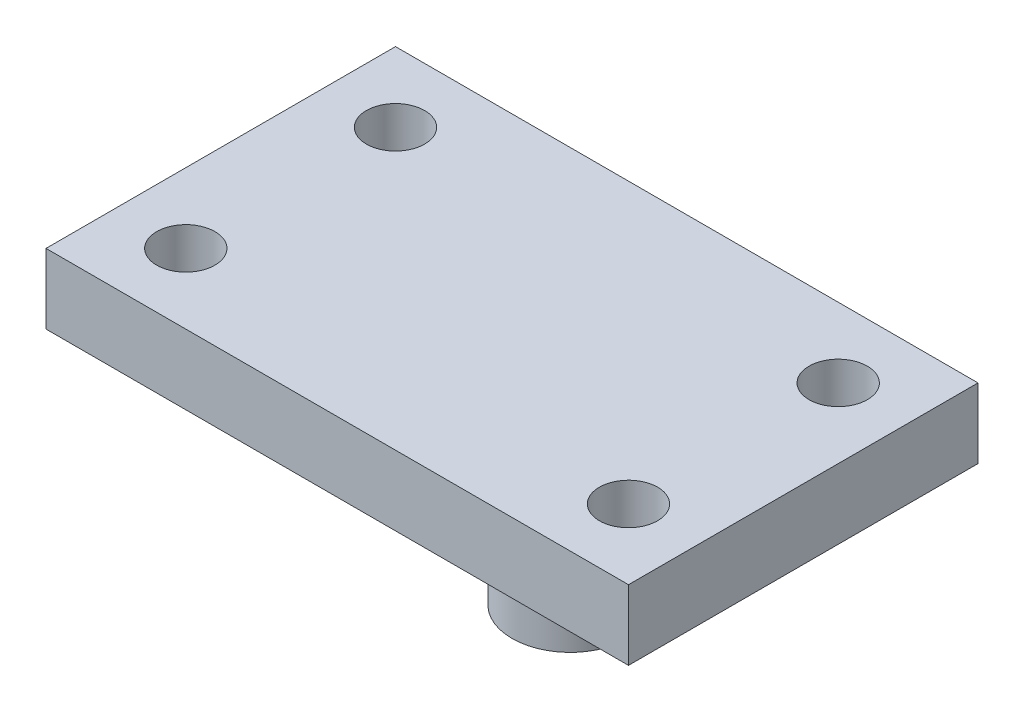
ISO-10303-21;
HEADER;
FILE_DESCRIPTION(('STEP AP214'),'2;1');
FILE_NAME('part.step','',(''),(''),'','','');
FILE_SCHEMA(('AUTOMOTIVE_DESIGN { 1 0 10303 214 1 1 1 1 }'));
ENDSEC;
DATA;
#1=APPLICATION_CONTEXT('core data for automotive mechanical design processes');
#2=APPLICATION_PROTOCOL_DEFINITION('international standard','automotive_design',2000,#1);
#3=PRODUCT_CONTEXT('',#1,'mechanical');
#4=PRODUCT('Part','Part','',(#3));
#5=PRODUCT_RELATED_PRODUCT_CATEGORY('part','',(#4));
#6=PRODUCT_DEFINITION_FORMATION('','',#4);
#7=PRODUCT_DEFINITION_CONTEXT('part definition',#1,'design');
#8=PRODUCT_DEFINITION('design','',#6,#7);
#9=PRODUCT_DEFINITION_SHAPE('','',#8);
#10=(LENGTH_UNIT() NAMED_UNIT(*) SI_UNIT(.MILLI.,.METRE.));
#11=(NAMED_UNIT(*) PLANE_ANGLE_UNIT() SI_UNIT($,.RADIAN.));
#12=(NAMED_UNIT(*) SI_UNIT($,.STERADIAN.) SOLID_ANGLE_UNIT());
#13=UNCERTAINTY_MEASURE_WITH_UNIT(LENGTH_MEASURE(1.E-05),#10,'distance_accuracy_value','');
#14=(GEOMETRIC_REPRESENTATION_CONTEXT(3) GLOBAL_UNCERTAINTY_ASSIGNED_CONTEXT((#13)) GLOBAL_UNIT_ASSIGNED_CONTEXT((#10,
#11,#12)) REPRESENTATION_CONTEXT('',''));
#15=CARTESIAN_POINT('',(0.,0.,0.));
#16=DIRECTION('',(0.,0.,1.));
#17=DIRECTION('',(1.,0.,0.));
#18=AXIS2_PLACEMENT_3D('',#15,#16,#17);
#19=CARTESIAN_POINT('',(125.,15.,-75.));
#20=DIRECTION('',(-1.,0.,0.));
#21=DIRECTION('',(0.,0.,1.));
#22=AXIS2_PLACEMENT_3D('',#19,#20,#21);
#23=PLANE('',#22);
#24=DIRECTION('',(0.,0.,-1.));
#25=VECTOR('',#24,1.);
#26=CARTESIAN_POINT('',(125.,-15.,-75.));
#27=LINE('',#26,#25);
#28=CARTESIAN_POINT('',(125.,-15.,75.));
#29=VERTEX_POINT('',#28);
#30=CARTESIAN_POINT('',(125.,-15.,-75.));
#31=VERTEX_POINT('',#30);
#32=EDGE_CURVE('E105',#29,#31,#27,.T.);
#33=ORIENTED_EDGE('',*,*,#32,.T.);
#34=DIRECTION('',(0.,-1.,0.));
#35=VECTOR('',#34,1.);
#36=CARTESIAN_POINT('',(125.,15.,-75.));
#37=LINE('',#36,#35);
#38=CARTESIAN_POINT('',(125.,15.,-75.));
#39=VERTEX_POINT('',#38);
#40=EDGE_CURVE('E47',#39,#31,#37,.T.);
#41=ORIENTED_EDGE('',*,*,#40,.F.);
#42=DIRECTION('',(0.,0.,-1.));
#43=VECTOR('',#42,1.);
#44=CARTESIAN_POINT('',(125.,15.,-75.));
#45=LINE('',#44,#43);
#46=CARTESIAN_POINT('',(125.,15.,75.));
#47=VERTEX_POINT('',#46);
#48=EDGE_CURVE('E91',#47,#39,#45,.T.);
#49=ORIENTED_EDGE('',*,*,#48,.F.);
#50=DIRECTION('',(0.,-1.,0.));
#51=VECTOR('',#50,1.);
#52=CARTESIAN_POINT('',(125.,15.,75.));
#53=LINE('',#52,#51);
#54=EDGE_CURVE('E101',#47,#29,#53,.T.);
#55=ORIENTED_EDGE('',*,*,#54,.T.);
#56=EDGE_LOOP('',(#33,#41,#49,#55));
#57=FACE_BOUND('',#56,.T.);
#58=ADVANCED_FACE('F39',(#57),#23,.F.);
#59=CARTESIAN_POINT('',(-125.,15.,-75.));
#60=DIRECTION('',(0.,0.,1.));
#61=DIRECTION('',(1.,0.,0.));
#62=AXIS2_PLACEMENT_3D('',#59,#60,#61);
#63=PLANE('',#62);
#64=DIRECTION('',(-1.,0.,0.));
#65=VECTOR('',#64,1.);
#66=CARTESIAN_POINT('',(-125.,-15.,-75.));
#67=LINE('',#66,#65);
#68=CARTESIAN_POINT('',(-125.,-15.,-75.));
#69=VERTEX_POINT('',#68);
#70=EDGE_CURVE('E96',#31,#69,#67,.T.);
#71=ORIENTED_EDGE('',*,*,#70,.T.);
#72=DIRECTION('',(0.,-1.,0.));
#73=VECTOR('',#72,1.);
#74=CARTESIAN_POINT('',(-125.,15.,-75.));
#75=LINE('',#74,#73);
#76=CARTESIAN_POINT('',(-125.,15.,-75.));
#77=VERTEX_POINT('',#76);
#78=EDGE_CURVE('E94',#77,#69,#75,.T.);
#79=ORIENTED_EDGE('',*,*,#78,.F.);
#80=DIRECTION('',(-1.,0.,0.));
#81=VECTOR('',#80,1.);
#82=CARTESIAN_POINT('',(-125.,15.,-75.));
#83=LINE('',#82,#81);
#84=EDGE_CURVE('E86',#39,#77,#83,.T.);
#85=ORIENTED_EDGE('',*,*,#84,.F.);
#86=ORIENTED_EDGE('',*,*,#40,.T.);
#87=EDGE_LOOP('',(#71,#79,#85,#86));
#88=FACE_BOUND('',#87,.T.);
#89=ADVANCED_FACE('F95',(#88),#63,.F.);
#90=CARTESIAN_POINT('',(-125.,15.,-75.));
#91=DIRECTION('',(1.,0.,0.));
#92=DIRECTION('',(0.,0.,-1.));
#93=AXIS2_PLACEMENT_3D('',#90,#91,#92);
#94=PLANE('',#93);
#95=DIRECTION('',(0.,0.,1.));
#96=VECTOR('',#95,1.);
#97=CARTESIAN_POINT('',(-125.,-15.,-75.));
#98=LINE('',#97,#96);
#99=CARTESIAN_POINT('',(-125.,-15.,75.));
#100=VERTEX_POINT('',#99);
#101=EDGE_CURVE('E72',#69,#100,#98,.T.);
#102=ORIENTED_EDGE('',*,*,#101,.T.);
#103=DIRECTION('',(0.,-1.,0.));
#104=VECTOR('',#103,1.);
#105=CARTESIAN_POINT('',(-125.,15.,75.));
#106=LINE('',#105,#104);
#107=CARTESIAN_POINT('',(-125.,15.,75.));
#108=VERTEX_POINT('',#107);
#109=EDGE_CURVE('E97',#108,#100,#106,.T.);
#110=ORIENTED_EDGE('',*,*,#109,.F.);
#111=DIRECTION('',(0.,0.,1.));
#112=VECTOR('',#111,1.);
#113=CARTESIAN_POINT('',(-125.,15.,-75.));
#114=LINE('',#113,#112);
#115=EDGE_CURVE('E89',#77,#108,#114,.T.);
#116=ORIENTED_EDGE('',*,*,#115,.F.);
#117=ORIENTED_EDGE('',*,*,#78,.T.);
#118=EDGE_LOOP('',(#102,#110,#116,#117));
#119=FACE_BOUND('',#118,.T.);
#120=ADVANCED_FACE('F99',(#119),#94,.F.);
#121=CARTESIAN_POINT('',(-125.,15.,75.));
#122=DIRECTION('',(0.,0.,-1.));
#123=DIRECTION('',(-1.,0.,0.));
#124=AXIS2_PLACEMENT_3D('',#121,#122,#123);
#125=PLANE('',#124);
#126=DIRECTION('',(1.,0.,0.));
#127=VECTOR('',#126,1.);
#128=CARTESIAN_POINT('',(-125.,-15.,75.));
#129=LINE('',#128,#127);
#130=EDGE_CURVE('E78',#100,#29,#129,.T.);
#131=ORIENTED_EDGE('',*,*,#130,.T.);
#132=ORIENTED_EDGE('',*,*,#54,.F.);
#133=DIRECTION('',(1.,0.,0.));
#134=VECTOR('',#133,1.);
#135=CARTESIAN_POINT('',(-125.,15.,75.));
#136=LINE('',#135,#134);
#137=EDGE_CURVE('E55',#108,#47,#136,.T.);
#138=ORIENTED_EDGE('',*,*,#137,.F.);
#139=ORIENTED_EDGE('',*,*,#109,.T.);
#140=EDGE_LOOP('',(#131,#132,#138,#139));
#141=FACE_BOUND('',#140,.T.);
#142=ADVANCED_FACE('F130',(#141),#125,.F.);
#143=CARTESIAN_POINT('',(0.,15.,0.));
#144=DIRECTION('',(0.,1.,0.));
#145=DIRECTION('',(0.,0.,1.));
#146=AXIS2_PLACEMENT_3D('',#143,#144,#145);
#147=PLANE('',#146);
#148=CARTESIAN_POINT('',(-95.,15.,-45.));
#149=DIRECTION('',(0.,1.,0.));
#150=DIRECTION('',(0.,0.,1.));
#151=AXIS2_PLACEMENT_3D('',#148,#149,#150);
#152=CIRCLE('',#151,12.5);
#153=CARTESIAN_POINT('',(-95.,15.,-32.5));
#154=VERTEX_POINT('',#153);
#155=EDGE_CURVE('E219',#154,#154,#152,.T.);
#156=ORIENTED_EDGE('',*,*,#155,.F.);
#157=EDGE_LOOP('',(#156));
#158=FACE_BOUND('',#157,.T.);
#159=CARTESIAN_POINT('',(95.,15.,45.));
#160=DIRECTION('',(0.,1.,0.));
#161=DIRECTION('',(0.,0.,-1.));
#162=AXIS2_PLACEMENT_3D('',#159,#160,#161);
#163=CIRCLE('',#162,12.5);
#164=CARTESIAN_POINT('',(95.,15.,32.5));
#165=VERTEX_POINT('',#164);
#166=EDGE_CURVE('E226',#165,#165,#163,.T.);
#167=ORIENTED_EDGE('',*,*,#166,.F.);
#168=EDGE_LOOP('',(#167));
#169=FACE_BOUND('',#168,.T.);
#170=CARTESIAN_POINT('',(95.,15.,-45.));
#171=DIRECTION('',(0.,1.,0.));
#172=DIRECTION('',(0.,0.,-1.));
#173=AXIS2_PLACEMENT_3D('',#170,#171,#172);
#174=CIRCLE('',#173,12.5);
#175=CARTESIAN_POINT('',(95.,15.,-57.5));
#176=VERTEX_POINT('',#175);
#177=EDGE_CURVE('E213',#176,#176,#174,.T.);
#178=ORIENTED_EDGE('',*,*,#177,.F.);
#179=EDGE_LOOP('',(#178));
#180=FACE_BOUND('',#179,.T.);
#181=CARTESIAN_POINT('',(-95.,15.,45.));
#182=DIRECTION('',(0.,1.,0.));
#183=DIRECTION('',(0.,0.,1.));
#184=AXIS2_PLACEMENT_3D('',#181,#182,#183);
#185=CIRCLE('',#184,12.5);
#186=CARTESIAN_POINT('',(-95.,15.,57.5));
#187=VERTEX_POINT('',#186);
#188=EDGE_CURVE('E222',#187,#187,#185,.T.);
#189=ORIENTED_EDGE('',*,*,#188,.F.);
#190=EDGE_LOOP('',(#189));
#191=FACE_BOUND('',#190,.T.);
#192=ORIENTED_EDGE('',*,*,#48,.T.);
#193=ORIENTED_EDGE('',*,*,#84,.T.);
#194=ORIENTED_EDGE('',*,*,#115,.T.);
#195=ORIENTED_EDGE('',*,*,#137,.T.);
#196=EDGE_LOOP('',(#192,#193,#194,#195));
#197=FACE_BOUND('',#196,.T.);
#198=ADVANCED_FACE('F87',(#158,#169,#180,#191,#197),#147,.T.);
#199=CARTESIAN_POINT('',(0.,-15.,0.));
#200=DIRECTION('',(0.,1.,0.));
#201=DIRECTION('',(0.,0.,1.));
#202=AXIS2_PLACEMENT_3D('',#199,#200,#201);
#203=PLANE('',#202);
#204=CARTESIAN_POINT('',(0.,-15.,-25.));
#205=DIRECTION('',(0.,1.,0.));
#206=DIRECTION('',(0.,0.,1.));
#207=AXIS2_PLACEMENT_3D('',#204,#205,#206);
#208=CIRCLE('',#207,25.);
#209=CARTESIAN_POINT('',(0.,-15.,0.));
#210=VERTEX_POINT('',#209);
#211=EDGE_CURVE('E11',#210,#210,#208,.F.);
#212=ORIENTED_EDGE('',*,*,#211,.F.);
#213=EDGE_LOOP('',(#212));
#214=FACE_BOUND('',#213,.T.);
#215=CARTESIAN_POINT('',(-95.,-15.,-45.));
#216=DIRECTION('',(0.,1.,0.));
#217=DIRECTION('',(0.,0.,1.));
#218=AXIS2_PLACEMENT_3D('',#215,#216,#217);
#219=CIRCLE('',#218,12.5);
#220=CARTESIAN_POINT('',(-95.,-15.,-32.5));
#221=VERTEX_POINT('',#220);
#222=EDGE_CURVE('E223',#221,#221,#219,.T.);
#223=ORIENTED_EDGE('',*,*,#222,.T.);
#224=EDGE_LOOP('',(#223));
#225=FACE_BOUND('',#224,.T.);
#226=CARTESIAN_POINT('',(95.,-15.,45.));
#227=DIRECTION('',(0.,1.,0.));
#228=DIRECTION('',(0.,0.,-1.));
#229=AXIS2_PLACEMENT_3D('',#226,#227,#228);
#230=CIRCLE('',#229,12.5);
#231=CARTESIAN_POINT('',(95.,-15.,32.5));
#232=VERTEX_POINT('',#231);
#233=EDGE_CURVE('E217',#232,#232,#230,.T.);
#234=ORIENTED_EDGE('',*,*,#233,.T.);
#235=EDGE_LOOP('',(#234));
#236=FACE_BOUND('',#235,.T.);
#237=CARTESIAN_POINT('',(95.,-15.,-45.));
#238=DIRECTION('',(0.,1.,0.));
#239=DIRECTION('',(0.,0.,-1.));
#240=AXIS2_PLACEMENT_3D('',#237,#238,#239);
#241=CIRCLE('',#240,12.5);
#242=CARTESIAN_POINT('',(95.,-15.,-57.5));
#243=VERTEX_POINT('',#242);
#244=EDGE_CURVE('E210',#243,#243,#241,.T.);
#245=ORIENTED_EDGE('',*,*,#244,.T.);
#246=EDGE_LOOP('',(#245));
#247=FACE_BOUND('',#246,.T.);
#248=CARTESIAN_POINT('',(-95.,-15.,45.));
#249=DIRECTION('',(0.,1.,0.));
#250=DIRECTION('',(0.,0.,1.));
#251=AXIS2_PLACEMENT_3D('',#248,#249,#250);
#252=CIRCLE('',#251,12.5);
#253=CARTESIAN_POINT('',(-95.,-15.,57.5));
#254=VERTEX_POINT('',#253);
#255=EDGE_CURVE('E108',#254,#254,#252,.T.);
#256=ORIENTED_EDGE('',*,*,#255,.T.);
#257=EDGE_LOOP('',(#256));
#258=FACE_BOUND('',#257,.T.);
#259=ORIENTED_EDGE('',*,*,#32,.F.);
#260=ORIENTED_EDGE('',*,*,#130,.F.);
#261=ORIENTED_EDGE('',*,*,#101,.F.);
#262=ORIENTED_EDGE('',*,*,#70,.F.);
#263=EDGE_LOOP('',(#259,#260,#261,#262));
#264=FACE_BOUND('',#263,.T.);
#265=ADVANCED_FACE('F116',(#214,#225,#236,#247,#258,#264),#203,.F.);
#266=CARTESIAN_POINT('',(-95.,-15.,45.));
#267=DIRECTION('',(0.,1.,0.));
#268=DIRECTION('',(0.,0.,1.));
#269=AXIS2_PLACEMENT_3D('',#266,#267,#268);
#270=CYLINDRICAL_SURFACE('',#269,12.5);
#271=ORIENTED_EDGE('',*,*,#255,.F.);
#272=EDGE_LOOP('',(#271));
#273=FACE_BOUND('',#272,.T.);
#274=ORIENTED_EDGE('',*,*,#188,.T.);
#275=EDGE_LOOP('',(#274));
#276=FACE_BOUND('',#275,.T.);
#277=ADVANCED_FACE('F118',(#273,#276),#270,.F.);
#278=CARTESIAN_POINT('',(95.,-15.,-45.));
#279=DIRECTION('',(0.,1.,0.));
#280=DIRECTION('',(0.,0.,1.));
#281=AXIS2_PLACEMENT_3D('',#278,#279,#280);
#282=CYLINDRICAL_SURFACE('',#281,12.5);
#283=ORIENTED_EDGE('',*,*,#244,.F.);
#284=EDGE_LOOP('',(#283));
#285=FACE_BOUND('',#284,.T.);
#286=ORIENTED_EDGE('',*,*,#177,.T.);
#287=EDGE_LOOP('',(#286));
#288=FACE_BOUND('',#287,.T.);
#289=ADVANCED_FACE('F126',(#285,#288),#282,.F.);
#290=CARTESIAN_POINT('',(95.,-15.,45.));
#291=DIRECTION('',(0.,1.,0.));
#292=DIRECTION('',(0.,0.,1.));
#293=AXIS2_PLACEMENT_3D('',#290,#291,#292);
#294=CYLINDRICAL_SURFACE('',#293,12.5);
#295=ORIENTED_EDGE('',*,*,#233,.F.);
#296=EDGE_LOOP('',(#295));
#297=FACE_BOUND('',#296,.T.);
#298=ORIENTED_EDGE('',*,*,#166,.T.);
#299=EDGE_LOOP('',(#298));
#300=FACE_BOUND('',#299,.T.);
#301=ADVANCED_FACE('F166',(#297,#300),#294,.F.);
#302=CARTESIAN_POINT('',(-95.,-15.,-45.));
#303=DIRECTION('',(0.,1.,0.));
#304=DIRECTION('',(0.,0.,1.));
#305=AXIS2_PLACEMENT_3D('',#302,#303,#304);
#306=CYLINDRICAL_SURFACE('',#305,12.5);
#307=ORIENTED_EDGE('',*,*,#222,.F.);
#308=EDGE_LOOP('',(#307));
#309=FACE_BOUND('',#308,.T.);
#310=ORIENTED_EDGE('',*,*,#155,.T.);
#311=EDGE_LOOP('',(#310));
#312=FACE_BOUND('',#311,.T.);
#313=ADVANCED_FACE('F174',(#309,#312),#306,.F.);
#314=CARTESIAN_POINT('',(0.,-105.,-25.));
#315=DIRECTION('',(0.,1.,0.));
#316=DIRECTION('',(0.,0.,1.));
#317=AXIS2_PLACEMENT_3D('',#314,#315,#316);
#318=CYLINDRICAL_SURFACE('',#317,25.);
#319=CARTESIAN_POINT('',(0.,-105.,-25.));
#320=DIRECTION('',(0.,-1.,0.));
#321=DIRECTION('',(0.,0.,-1.));
#322=AXIS2_PLACEMENT_3D('',#319,#320,#321);
#323=CIRCLE('',#322,25.);
#324=CARTESIAN_POINT('',(0.,-105.,0.));
#325=VERTEX_POINT('',#324);
#326=EDGE_CURVE('E209',#325,#325,#323,.T.);
#327=CARTESIAN_POINT('',(0.,-105.,0.));
#328=CARTESIAN_POINT('',(0.,-104.0625,0.));
#329=CARTESIAN_POINT('',(0.,-103.125,0.));
#330=CARTESIAN_POINT('',(0.,-101.25,0.));
#331=CARTESIAN_POINT('',(0.,-100.3125,0.));
#332=CARTESIAN_POINT('',(0.,-98.4375,0.));
#333=CARTESIAN_POINT('',(0.,-97.5,0.));
#334=CARTESIAN_POINT('',(0.,-95.625,0.));
#335=CARTESIAN_POINT('',(0.,-94.6875,0.));
#336=CARTESIAN_POINT('',(0.,-92.8125,0.));
#337=CARTESIAN_POINT('',(0.,-91.875,0.));
#338=CARTESIAN_POINT('',(0.,-90.,0.));
#339=CARTESIAN_POINT('',(0.,-89.0625,0.));
#340=CARTESIAN_POINT('',(0.,-87.1875,0.));
#341=CARTESIAN_POINT('',(0.,-86.25,0.));
#342=CARTESIAN_POINT('',(0.,-84.375,0.));
#343=CARTESIAN_POINT('',(0.,-83.4375,0.));
#344=CARTESIAN_POINT('',(0.,-81.5625,0.));
#345=CARTESIAN_POINT('',(0.,-80.625,0.));
#346=CARTESIAN_POINT('',(0.,-78.75,0.));
#347=CARTESIAN_POINT('',(0.,-77.8125,0.));
#348=CARTESIAN_POINT('',(0.,-75.9375,0.));
#349=CARTESIAN_POINT('',(0.,-75.,0.));
#350=CARTESIAN_POINT('',(0.,-73.125,0.));
#351=CARTESIAN_POINT('',(0.,-72.1875,0.));
#352=CARTESIAN_POINT('',(0.,-70.3125,0.));
#353=CARTESIAN_POINT('',(0.,-69.375,0.));
#354=CARTESIAN_POINT('',(0.,-67.5,0.));
#355=CARTESIAN_POINT('',(0.,-66.5625,0.));
#356=CARTESIAN_POINT('',(0.,-64.6875,0.));
#357=CARTESIAN_POINT('',(0.,-63.75,0.));
#358=CARTESIAN_POINT('',(0.,-61.875,0.));
#359=CARTESIAN_POINT('',(0.,-60.9375,0.));
#360=CARTESIAN_POINT('',(0.,-59.0625,0.));
#361=CARTESIAN_POINT('',(0.,-58.125,0.));
#362=CARTESIAN_POINT('',(0.,-56.25,0.));
#363=CARTESIAN_POINT('',(0.,-55.3125,0.));
#364=CARTESIAN_POINT('',(0.,-53.4375,0.));
#365=CARTESIAN_POINT('',(0.,-52.5,0.));
#366=CARTESIAN_POINT('',(0.,-50.625,0.));
#367=CARTESIAN_POINT('',(0.,-49.6875,0.));
#368=CARTESIAN_POINT('',(0.,-47.8125,0.));
#369=CARTESIAN_POINT('',(0.,-46.875,0.));
#370=CARTESIAN_POINT('',(0.,-45.,0.));
#371=CARTESIAN_POINT('',(0.,-44.0625,0.));
#372=CARTESIAN_POINT('',(0.,-42.1875,0.));
#373=CARTESIAN_POINT('',(0.,-41.25,0.));
#374=CARTESIAN_POINT('',(0.,-39.375,0.));
#375=CARTESIAN_POINT('',(0.,-38.4375,0.));
#376=CARTESIAN_POINT('',(0.,-36.5625,0.));
#377=CARTESIAN_POINT('',(0.,-35.625,0.));
#378=CARTESIAN_POINT('',(0.,-33.75,0.));
#379=CARTESIAN_POINT('',(0.,-32.8125,0.));
#380=CARTESIAN_POINT('',(0.,-30.9375,0.));
#381=CARTESIAN_POINT('',(0.,-30.,0.));
#382=CARTESIAN_POINT('',(0.,-28.125,0.));
#383=CARTESIAN_POINT('',(0.,-27.1875,0.));
#384=CARTESIAN_POINT('',(0.,-25.3125,0.));
#385=CARTESIAN_POINT('',(0.,-24.375,0.));
#386=CARTESIAN_POINT('',(0.,-22.5,0.));
#387=CARTESIAN_POINT('',(0.,-21.5625,0.));
#388=CARTESIAN_POINT('',(0.,-19.6875,0.));
#389=CARTESIAN_POINT('',(0.,-18.75,0.));
#390=CARTESIAN_POINT('',(0.,-16.875,0.));
#391=CARTESIAN_POINT('',(0.,-15.9375,0.));
#392=CARTESIAN_POINT('',(0.,-15.,0.));
#393=B_SPLINE_CURVE_WITH_KNOTS('',3,(#327,#328,#329,#330,#331,#332,#333,#334,#335,#336,#337,
#338,#339,#340,#341,#342,#343,#344,#345,#346,#347,#348,#349,#350,#351,#352,#353,#354,#355,#356,
#357,#358,#359,#360,#361,#362,#363,#364,#365,#366,#367,#368,#369,#370,#371,#372,#373,#374,#375,
#376,#377,#378,#379,#380,#381,#382,#383,#384,#385,#386,#387,#388,#389,#390,#391,#392),
.UNSPECIFIED.,.F.,.F.,(4,2,2,2,2,2,2,2,2,2,2,2,2,2,2,2,2,2,2,2,2,2,2,2,2,2,2,2,2,2,2,2,4),(0.,
2.8125,5.62499999999999,8.43749999999999,11.25,14.0625,16.875,19.6875,22.5,25.3125,28.125,
30.9375,33.75,36.5625,39.375,42.1875,45.,47.8125,50.625,53.4375,56.25,59.0625,61.875,64.6875,
67.5,70.3125,73.125,75.9375,78.75,81.5625,84.375,87.1875,90.),.UNSPECIFIED.);
#394=EDGE_CURVE('BSEAM182',#325,#210,#393,.T.);
#395=ORIENTED_EDGE('',*,*,#326,.F.);
#396=ORIENTED_EDGE('',*,*,#211,.T.);
#397=ORIENTED_EDGE('',*,*,#394,.T.);
#398=ORIENTED_EDGE('',*,*,#394,.F.);
#399=EDGE_LOOP('',(#395,#397,#396,#398));
#400=FACE_BOUND('',#399,.T.);
#401=ADVANCED_FACE('F182',(#400),#318,.T.);
#402=CARTESIAN_POINT('',(0.,-105.,-25.));
#403=DIRECTION('',(0.,-1.,0.));
#404=DIRECTION('',(0.,0.,-1.));
#405=AXIS2_PLACEMENT_3D('',#402,#403,#404);
#406=PLANE('',#405);
#407=ORIENTED_EDGE('',*,*,#326,.T.);
#408=EDGE_LOOP('',(#407));
#409=FACE_BOUND('',#408,.T.);
#410=ADVANCED_FACE('F194',(#409),#406,.T.);
#411=CLOSED_SHELL('',(#58,#89,#120,#142,#198,#265,#277,#289,#301,#313,#401,#410));
#412=MANIFOLD_SOLID_BREP('B2',#411);
#413=ADVANCED_BREP_SHAPE_REPRESENTATION('',(#18,#412),#14);
#414=SHAPE_DEFINITION_REPRESENTATION(#9,#413);
ENDSEC;
END-ISO-10303-21;
